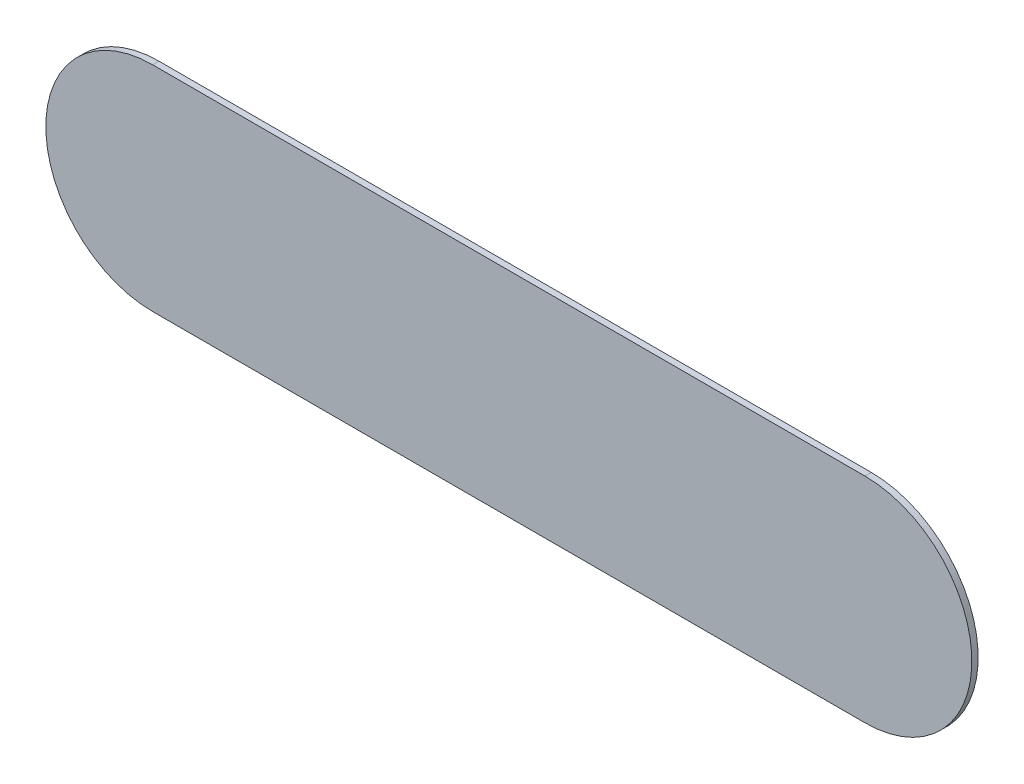
ISO-10303-21;
HEADER;
FILE_DESCRIPTION(('STEP AP214'),'2;1');
FILE_NAME('part.step','',(''),(''),'','','');
FILE_SCHEMA(('AUTOMOTIVE_DESIGN { 1 0 10303 214 1 1 1 1 }'));
ENDSEC;
DATA;
#1=APPLICATION_CONTEXT('core data for automotive mechanical design processes');
#2=APPLICATION_PROTOCOL_DEFINITION('international standard','automotive_design',2000,#1);
#3=PRODUCT_CONTEXT('',#1,'mechanical');
#4=PRODUCT('Part','Part','',(#3));
#5=PRODUCT_RELATED_PRODUCT_CATEGORY('part','',(#4));
#6=PRODUCT_DEFINITION_FORMATION('','',#4);
#7=PRODUCT_DEFINITION_CONTEXT('part definition',#1,'design');
#8=PRODUCT_DEFINITION('design','',#6,#7);
#9=PRODUCT_DEFINITION_SHAPE('','',#8);
#10=(LENGTH_UNIT() NAMED_UNIT(*) SI_UNIT(.MILLI.,.METRE.));
#11=(NAMED_UNIT(*) PLANE_ANGLE_UNIT() SI_UNIT($,.RADIAN.));
#12=(NAMED_UNIT(*) SI_UNIT($,.STERADIAN.) SOLID_ANGLE_UNIT());
#13=UNCERTAINTY_MEASURE_WITH_UNIT(LENGTH_MEASURE(1.E-05),#10,'distance_accuracy_value','');
#14=(GEOMETRIC_REPRESENTATION_CONTEXT(3) GLOBAL_UNCERTAINTY_ASSIGNED_CONTEXT((#13)) GLOBAL_UNIT_ASSIGNED_CONTEXT((#10,
#11,#12)) REPRESENTATION_CONTEXT('',''));
#15=CARTESIAN_POINT('',(0.,0.,0.));
#16=DIRECTION('',(0.,0.,1.));
#17=DIRECTION('',(1.,0.,0.));
#18=AXIS2_PLACEMENT_3D('',#15,#16,#17);
#19=CARTESIAN_POINT('',(88.4000264,118.4000172,0.));
#20=DIRECTION('',(0.,1.,0.));
#21=DIRECTION('',(1.,0.,0.));
#22=AXIS2_PLACEMENT_3D('',#19,#20,#21);
#23=PLANE('',#22);
#24=DIRECTION('',(1.,0.,0.));
#25=VECTOR('',#24,1.);
#26=CARTESIAN_POINT('',(88.4000264,118.4000172,0.03556));
#27=LINE('',#26,#25);
#28=CARTESIAN_POINT('',(88.4000264,118.4000172,0.03556));
#29=VERTEX_POINT('',#28);
#30=CARTESIAN_POINT('',(92.4000184,118.4000172,0.03556));
#31=VERTEX_POINT('',#30);
#32=EDGE_CURVE('E11',#29,#31,#27,.T.);
#33=ORIENTED_EDGE('',*,*,#32,.F.);
#34=DIRECTION('',(0.,0.,1.));
#35=VECTOR('',#34,1.);
#36=CARTESIAN_POINT('',(88.4000264,118.4000172,0.));
#37=LINE('',#36,#35);
#38=CARTESIAN_POINT('',(88.4000264,118.4000172,0.));
#39=VERTEX_POINT('',#38);
#40=EDGE_CURVE('E24',#39,#29,#37,.T.);
#41=ORIENTED_EDGE('',*,*,#40,.F.);
#42=DIRECTION('',(1.,0.,0.));
#43=VECTOR('',#42,1.);
#44=CARTESIAN_POINT('',(88.4000264,118.4000172,0.));
#45=LINE('',#44,#43);
#46=CARTESIAN_POINT('',(92.4000184,118.4000172,0.));
#47=VERTEX_POINT('',#46);
#48=EDGE_CURVE('E75',#39,#47,#45,.T.);
#49=ORIENTED_EDGE('',*,*,#48,.T.);
#50=DIRECTION('',(0.,0.,1.));
#51=VECTOR('',#50,1.);
#52=CARTESIAN_POINT('',(92.4000184,118.4000172,0.));
#53=LINE('',#52,#51);
#54=EDGE_CURVE('E37',#47,#31,#53,.T.);
#55=ORIENTED_EDGE('',*,*,#54,.T.);
#56=EDGE_LOOP('',(#33,#41,#49,#55));
#57=FACE_BOUND('',#56,.T.);
#58=ADVANCED_FACE('F17',(#57),#23,.F.);
#59=CARTESIAN_POINT('',(92.4000184,119.000016,0.));
#60=DIRECTION('',(0.,0.,-1.));
#61=DIRECTION('',(0.,-1.,0.));
#62=AXIS2_PLACEMENT_3D('',#59,#60,#61);
#63=CYLINDRICAL_SURFACE('',#62,0.599998800000004);
#64=CARTESIAN_POINT('',(92.4000184,119.000016,0.03556));
#65=DIRECTION('',(0.,0.,1.));
#66=DIRECTION('',(0.,-1.,0.));
#67=AXIS2_PLACEMENT_3D('',#64,#65,#66);
#68=CIRCLE('',#67,0.599998800000004);
#69=CARTESIAN_POINT('',(92.4000184,119.6000148,0.03556));
#70=VERTEX_POINT('',#69);
#71=EDGE_CURVE('E83',#31,#70,#68,.T.);
#72=ORIENTED_EDGE('',*,*,#71,.F.);
#73=ORIENTED_EDGE('',*,*,#54,.F.);
#74=CARTESIAN_POINT('',(92.4000184,119.000016,0.));
#75=DIRECTION('',(0.,0.,1.));
#76=DIRECTION('',(0.,-1.,0.));
#77=AXIS2_PLACEMENT_3D('',#74,#75,#76);
#78=CIRCLE('',#77,0.599998800000004);
#79=CARTESIAN_POINT('',(92.4000184,119.6000148,0.));
#80=VERTEX_POINT('',#79);
#81=EDGE_CURVE('E81',#47,#80,#78,.T.);
#82=ORIENTED_EDGE('',*,*,#81,.T.);
#83=DIRECTION('',(0.,0.,1.));
#84=VECTOR('',#83,1.);
#85=CARTESIAN_POINT('',(92.4000184,119.6000148,0.));
#86=LINE('',#85,#84);
#87=EDGE_CURVE('E67',#80,#70,#86,.T.);
#88=ORIENTED_EDGE('',*,*,#87,.T.);
#89=EDGE_LOOP('',(#72,#73,#82,#88));
#90=FACE_BOUND('',#89,.T.);
#91=ADVANCED_FACE('F89',(#90),#63,.T.);
#92=CARTESIAN_POINT('',(92.4000184,119.6000148,0.));
#93=DIRECTION('',(0.,-1.,0.));
#94=DIRECTION('',(-1.,0.,0.));
#95=AXIS2_PLACEMENT_3D('',#92,#93,#94);
#96=PLANE('',#95);
#97=DIRECTION('',(-1.,0.,0.));
#98=VECTOR('',#97,1.);
#99=CARTESIAN_POINT('',(92.4000184,119.6000148,0.03556));
#100=LINE('',#99,#98);
#101=CARTESIAN_POINT('',(88.4000264,119.6000148,0.03556));
#102=VERTEX_POINT('',#101);
#103=EDGE_CURVE('E71',#70,#102,#100,.T.);
#104=ORIENTED_EDGE('',*,*,#103,.F.);
#105=ORIENTED_EDGE('',*,*,#87,.F.);
#106=DIRECTION('',(-1.,0.,0.));
#107=VECTOR('',#106,1.);
#108=CARTESIAN_POINT('',(92.4000184,119.6000148,0.));
#109=LINE('',#108,#107);
#110=CARTESIAN_POINT('',(88.4000264,119.6000148,0.));
#111=VERTEX_POINT('',#110);
#112=EDGE_CURVE('E63',#80,#111,#109,.T.);
#113=ORIENTED_EDGE('',*,*,#112,.T.);
#114=DIRECTION('',(0.,0.,1.));
#115=VECTOR('',#114,1.);
#116=CARTESIAN_POINT('',(88.4000264,119.6000148,0.));
#117=LINE('',#116,#115);
#118=EDGE_CURVE('E53',#111,#102,#117,.T.);
#119=ORIENTED_EDGE('',*,*,#118,.T.);
#120=EDGE_LOOP('',(#104,#105,#113,#119));
#121=FACE_BOUND('',#120,.T.);
#122=ADVANCED_FACE('F66',(#121),#96,.F.);
#123=CARTESIAN_POINT('',(88.4000264,119.000016,0.));
#124=DIRECTION('',(0.,0.,-1.));
#125=DIRECTION('',(0.,1.,0.));
#126=AXIS2_PLACEMENT_3D('',#123,#124,#125);
#127=CYLINDRICAL_SURFACE('',#126,0.599998800000004);
#128=CARTESIAN_POINT('',(88.4000264,119.000016,0.03556));
#129=DIRECTION('',(0.,0.,1.));
#130=DIRECTION('',(0.,1.,0.));
#131=AXIS2_PLACEMENT_3D('',#128,#129,#130);
#132=CIRCLE('',#131,0.599998800000004);
#133=EDGE_CURVE('E59',#102,#29,#132,.T.);
#134=ORIENTED_EDGE('',*,*,#133,.F.);
#135=ORIENTED_EDGE('',*,*,#118,.F.);
#136=CARTESIAN_POINT('',(88.4000264,119.000016,0.));
#137=DIRECTION('',(0.,0.,1.));
#138=DIRECTION('',(0.,1.,0.));
#139=AXIS2_PLACEMENT_3D('',#136,#137,#138);
#140=CIRCLE('',#139,0.599998800000004);
#141=EDGE_CURVE('E57',#111,#39,#140,.T.);
#142=ORIENTED_EDGE('',*,*,#141,.T.);
#143=ORIENTED_EDGE('',*,*,#40,.T.);
#144=EDGE_LOOP('',(#134,#135,#142,#143));
#145=FACE_BOUND('',#144,.T.);
#146=ADVANCED_FACE('F55',(#145),#127,.T.);
#147=CARTESIAN_POINT('',(88.4000264,118.4000172,0.));
#148=DIRECTION('',(0.,0.,-1.));
#149=DIRECTION('',(-1.,0.,0.));
#150=AXIS2_PLACEMENT_3D('',#147,#148,#149);
#151=PLANE('',#150);
#152=ORIENTED_EDGE('',*,*,#141,.F.);
#153=ORIENTED_EDGE('',*,*,#112,.F.);
#154=ORIENTED_EDGE('',*,*,#81,.F.);
#155=ORIENTED_EDGE('',*,*,#48,.F.);
#156=EDGE_LOOP('',(#152,#153,#154,#155));
#157=FACE_BOUND('',#156,.T.);
#158=ADVANCED_FACE('F74',(#157),#151,.T.);
#159=CARTESIAN_POINT('',(88.4000264,118.4000172,0.03556));
#160=DIRECTION('',(0.,0.,-1.));
#161=DIRECTION('',(-1.,0.,0.));
#162=AXIS2_PLACEMENT_3D('',#159,#160,#161);
#163=PLANE('',#162);
#164=ORIENTED_EDGE('',*,*,#32,.T.);
#165=ORIENTED_EDGE('',*,*,#71,.T.);
#166=ORIENTED_EDGE('',*,*,#103,.T.);
#167=ORIENTED_EDGE('',*,*,#133,.T.);
#168=EDGE_LOOP('',(#164,#165,#166,#167));
#169=FACE_BOUND('',#168,.T.);
#170=ADVANCED_FACE('F91',(#169),#163,.F.);
#171=CLOSED_SHELL('',(#58,#91,#122,#146,#158,#170));
#172=MANIFOLD_SOLID_BREP('B1',#171);
#173=ADVANCED_BREP_SHAPE_REPRESENTATION('',(#18,#172),#14);
#174=SHAPE_DEFINITION_REPRESENTATION(#9,#173);
ENDSEC;
END-ISO-10303-21;
